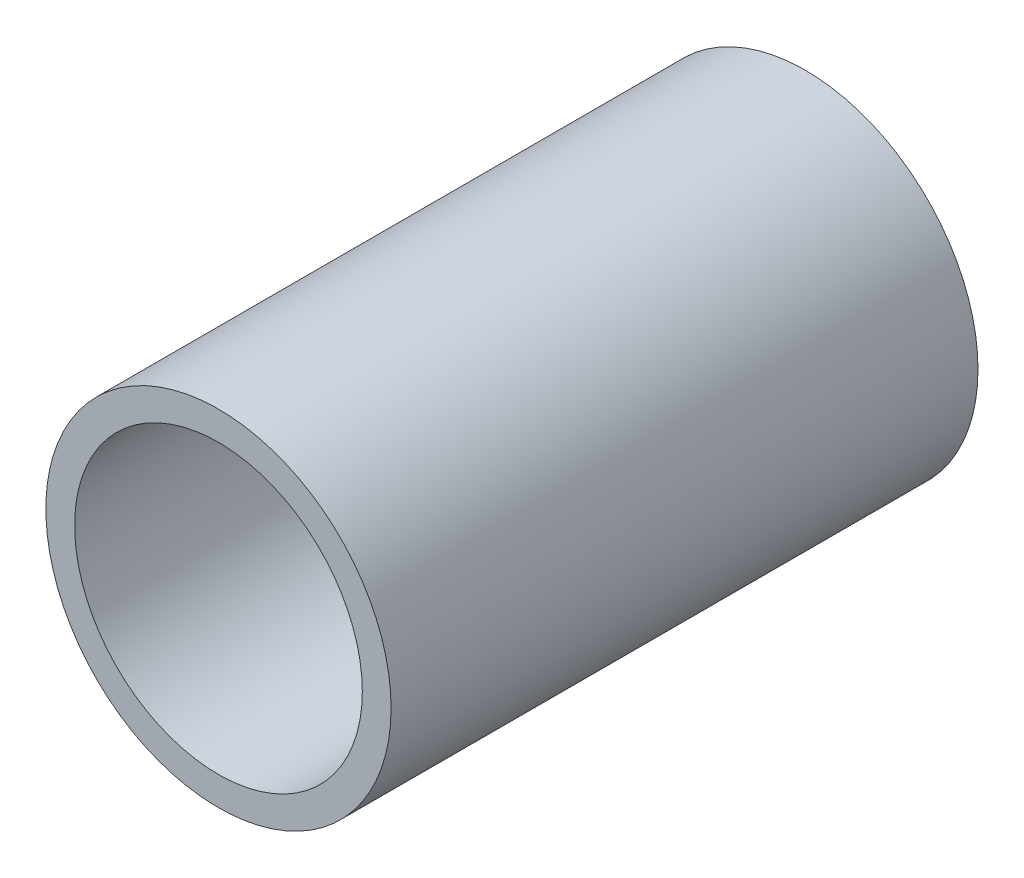
ISO-10303-21;
HEADER;
FILE_DESCRIPTION(('STEP AP214'),'2;1');
FILE_NAME('part.step','',(''),(''),'','','');
FILE_SCHEMA(('AUTOMOTIVE_DESIGN { 1 0 10303 214 1 1 1 1 }'));
ENDSEC;
DATA;
#1=APPLICATION_CONTEXT('core data for automotive mechanical design processes');
#2=APPLICATION_PROTOCOL_DEFINITION('international standard','automotive_design',2000,#1);
#3=PRODUCT_CONTEXT('',#1,'mechanical');
#4=PRODUCT('Part','Part','',(#3));
#5=PRODUCT_RELATED_PRODUCT_CATEGORY('part','',(#4));
#6=PRODUCT_DEFINITION_FORMATION('','',#4);
#7=PRODUCT_DEFINITION_CONTEXT('part definition',#1,'design');
#8=PRODUCT_DEFINITION('design','',#6,#7);
#9=PRODUCT_DEFINITION_SHAPE('','',#8);
#10=(LENGTH_UNIT() NAMED_UNIT(*) SI_UNIT(.MILLI.,.METRE.));
#11=(NAMED_UNIT(*) PLANE_ANGLE_UNIT() SI_UNIT($,.RADIAN.));
#12=(NAMED_UNIT(*) SI_UNIT($,.STERADIAN.) SOLID_ANGLE_UNIT());
#13=UNCERTAINTY_MEASURE_WITH_UNIT(LENGTH_MEASURE(1.E-05),#10,'distance_accuracy_value','');
#14=(GEOMETRIC_REPRESENTATION_CONTEXT(3) GLOBAL_UNCERTAINTY_ASSIGNED_CONTEXT((#13)) GLOBAL_UNIT_ASSIGNED_CONTEXT((#10,
#11,#12)) REPRESENTATION_CONTEXT('',''));
#15=CARTESIAN_POINT('',(0.,0.,0.));
#16=DIRECTION('',(0.,0.,1.));
#17=DIRECTION('',(1.,0.,0.));
#18=AXIS2_PLACEMENT_3D('',#15,#16,#17);
#19=CARTESIAN_POINT('',(0.,0.,51.));
#20=DIRECTION('',(0.,0.,-1.));
#21=DIRECTION('',(-1.,0.,0.));
#22=AXIS2_PLACEMENT_3D('',#19,#20,#21);
#23=CYLINDRICAL_SURFACE('',#22,15.);
#24=CARTESIAN_POINT('',(0.,0.,51.));
#25=DIRECTION('',(0.,0.,1.));
#26=DIRECTION('',(1.,0.,0.));
#27=AXIS2_PLACEMENT_3D('',#24,#25,#26);
#28=CIRCLE('',#27,15.);
#29=CARTESIAN_POINT('',(15.,0.,51.));
#30=VERTEX_POINT('',#29);
#31=EDGE_CURVE('E10',#30,#30,#28,.T.);
#32=ORIENTED_EDGE('',*,*,#31,.F.);
#33=EDGE_LOOP('',(#32));
#34=FACE_BOUND('',#33,.T.);
#35=CARTESIAN_POINT('',(0.,0.,0.));
#36=DIRECTION('',(0.,0.,1.));
#37=DIRECTION('',(1.,0.,0.));
#38=AXIS2_PLACEMENT_3D('',#35,#36,#37);
#39=CIRCLE('',#38,15.);
#40=CARTESIAN_POINT('',(15.,0.,0.));
#41=VERTEX_POINT('',#40);
#42=EDGE_CURVE('E33',#41,#41,#39,.T.);
#43=ORIENTED_EDGE('',*,*,#42,.T.);
#44=EDGE_LOOP('',(#43));
#45=FACE_BOUND('',#44,.T.);
#46=ADVANCED_FACE('F30',(#34,#45),#23,.T.);
#47=CARTESIAN_POINT('',(0.,0.,51.));
#48=DIRECTION('',(0.,0.,1.));
#49=DIRECTION('',(1.,0.,0.));
#50=AXIS2_PLACEMENT_3D('',#47,#48,#49);
#51=PLANE('',#50);
#52=CARTESIAN_POINT('',(0.,0.,51.));
#53=DIRECTION('',(0.,0.,1.));
#54=DIRECTION('',(1.,0.,0.));
#55=AXIS2_PLACEMENT_3D('',#52,#53,#54);
#56=CIRCLE('',#55,12.5);
#57=CARTESIAN_POINT('',(12.5,0.,51.));
#58=VERTEX_POINT('',#57);
#59=EDGE_CURVE('E42',#58,#58,#56,.T.);
#60=ORIENTED_EDGE('',*,*,#59,.F.);
#61=EDGE_LOOP('',(#60));
#62=FACE_BOUND('',#61,.T.);
#63=ORIENTED_EDGE('',*,*,#31,.T.);
#64=EDGE_LOOP('',(#63));
#65=FACE_BOUND('',#64,.T.);
#66=ADVANCED_FACE('F57',(#62,#65),#51,.T.);
#67=CARTESIAN_POINT('',(0.,0.,0.));
#68=DIRECTION('',(0.,0.,1.));
#69=DIRECTION('',(1.,0.,0.));
#70=AXIS2_PLACEMENT_3D('',#67,#68,#69);
#71=PLANE('',#70);
#72=ORIENTED_EDGE('',*,*,#42,.F.);
#73=EDGE_LOOP('',(#72));
#74=FACE_BOUND('',#73,.T.);
#75=ADVANCED_FACE('F53',(#74),#71,.F.);
#76=CARTESIAN_POINT('',(0.,0.,4.));
#77=DIRECTION('',(0.,0.,1.));
#78=DIRECTION('',(1.,0.,0.));
#79=AXIS2_PLACEMENT_3D('',#76,#77,#78);
#80=CYLINDRICAL_SURFACE('',#79,12.5);
#81=CARTESIAN_POINT('',(0.,0.,4.));
#82=DIRECTION('',(0.,0.,1.));
#83=DIRECTION('',(1.,0.,0.));
#84=AXIS2_PLACEMENT_3D('',#81,#82,#83);
#85=CIRCLE('',#84,12.5);
#86=CARTESIAN_POINT('',(12.5,0.,4.));
#87=VERTEX_POINT('',#86);
#88=EDGE_CURVE('E40',#87,#87,#85,.T.);
#89=ORIENTED_EDGE('',*,*,#88,.F.);
#90=EDGE_LOOP('',(#89));
#91=FACE_BOUND('',#90,.T.);
#92=ORIENTED_EDGE('',*,*,#59,.T.);
#93=EDGE_LOOP('',(#92));
#94=FACE_BOUND('',#93,.T.);
#95=ADVANCED_FACE('F50',(#91,#94),#80,.F.);
#96=CARTESIAN_POINT('',(0.,0.,4.));
#97=DIRECTION('',(0.,0.,1.));
#98=DIRECTION('',(1.,0.,0.));
#99=AXIS2_PLACEMENT_3D('',#96,#97,#98);
#100=PLANE('',#99);
#101=ORIENTED_EDGE('',*,*,#88,.T.);
#102=EDGE_LOOP('',(#101));
#103=FACE_BOUND('',#102,.T.);
#104=ADVANCED_FACE('F48',(#103),#100,.T.);
#105=CLOSED_SHELL('',(#46,#66,#75,#95,#104));
#106=MANIFOLD_SOLID_BREP('B2',#105);
#107=ADVANCED_BREP_SHAPE_REPRESENTATION('',(#18,#106),#14);
#108=SHAPE_DEFINITION_REPRESENTATION(#9,#107);
ENDSEC;
END-ISO-10303-21;
